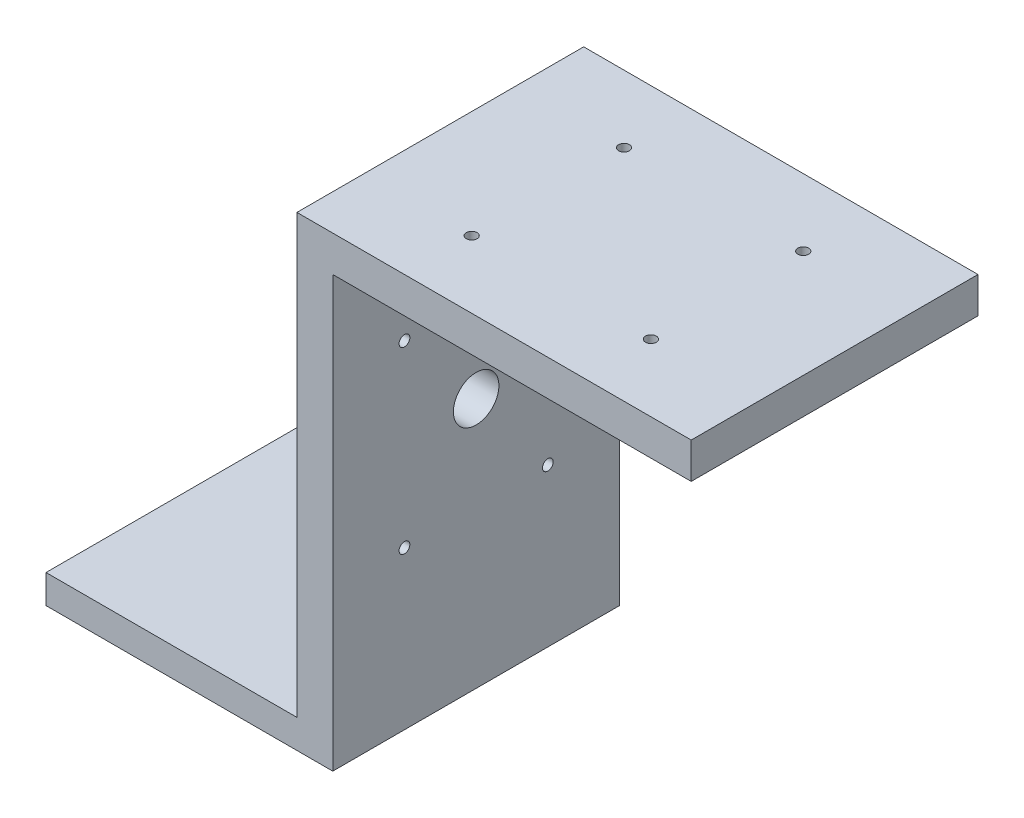
ISO-10303-21;
HEADER;
FILE_DESCRIPTION(('STEP AP214'),'2;1');
FILE_NAME('part.step','',(''),(''),'','','');
FILE_SCHEMA(('AUTOMOTIVE_DESIGN { 1 0 10303 214 1 1 1 1 }'));
ENDSEC;
DATA;
#1=APPLICATION_CONTEXT('core data for automotive mechanical design processes');
#2=APPLICATION_PROTOCOL_DEFINITION('international standard','automotive_design',2000,#1);
#3=PRODUCT_CONTEXT('',#1,'mechanical');
#4=PRODUCT('Part','Part','',(#3));
#5=PRODUCT_RELATED_PRODUCT_CATEGORY('part','',(#4));
#6=PRODUCT_DEFINITION_FORMATION('','',#4);
#7=PRODUCT_DEFINITION_CONTEXT('part definition',#1,'design');
#8=PRODUCT_DEFINITION('design','',#6,#7);
#9=PRODUCT_DEFINITION_SHAPE('','',#8);
#10=(LENGTH_UNIT() NAMED_UNIT(*) SI_UNIT(.MILLI.,.METRE.));
#11=(NAMED_UNIT(*) PLANE_ANGLE_UNIT() SI_UNIT($,.RADIAN.));
#12=(NAMED_UNIT(*) SI_UNIT($,.STERADIAN.) SOLID_ANGLE_UNIT());
#13=UNCERTAINTY_MEASURE_WITH_UNIT(LENGTH_MEASURE(1.E-05),#10,'distance_accuracy_value','');
#14=(GEOMETRIC_REPRESENTATION_CONTEXT(3) GLOBAL_UNCERTAINTY_ASSIGNED_CONTEXT((#13)) GLOBAL_UNIT_ASSIGNED_CONTEXT((#10,
#11,#12)) REPRESENTATION_CONTEXT('',''));
#15=CARTESIAN_POINT('',(0.,0.,0.));
#16=DIRECTION('',(0.,0.,1.));
#17=DIRECTION('',(1.,0.,0.));
#18=AXIS2_PLACEMENT_3D('',#15,#16,#17);
#19=CARTESIAN_POINT('',(0.,50.,20.));
#20=DIRECTION('',(-1.,0.,0.));
#21=DIRECTION('',(0.,0.,1.));
#22=AXIS2_PLACEMENT_3D('',#19,#20,#21);
#23=PLANE('',#22);
#24=CARTESIAN_POINT('',(0.,35.,0.));
#25=DIRECTION('',(-1.,0.,0.));
#26=DIRECTION('',(0.,0.,1.));
#27=AXIS2_PLACEMENT_3D('',#24,#25,#26);
#28=CIRCLE('',#27,3.175);
#29=CARTESIAN_POINT('',(0.,35.,3.175));
#30=VERTEX_POINT('',#29);
#31=EDGE_CURVE('E260',#30,#30,#28,.T.);
#32=ORIENTED_EDGE('',*,*,#31,.T.);
#33=EDGE_LOOP('',(#32));
#34=FACE_BOUND('',#33,.T.);
#35=CARTESIAN_POINT('',(0.,47.,-9.99999999999999));
#36=DIRECTION('',(-1.,0.,0.));
#37=DIRECTION('',(0.,0.,1.));
#38=AXIS2_PLACEMENT_3D('',#35,#36,#37);
#39=CIRCLE('',#38,0.75);
#40=CARTESIAN_POINT('',(0.,47.,-9.24999999999999));
#41=VERTEX_POINT('',#40);
#42=EDGE_CURVE('E133',#41,#41,#39,.T.);
#43=ORIENTED_EDGE('',*,*,#42,.T.);
#44=EDGE_LOOP('',(#43));
#45=FACE_BOUND('',#44,.T.);
#46=CARTESIAN_POINT('',(0.,47.,9.99999999999999));
#47=DIRECTION('',(-1.,0.,0.));
#48=DIRECTION('',(0.,0.,1.));
#49=AXIS2_PLACEMENT_3D('',#46,#47,#48);
#50=CIRCLE('',#49,0.75);
#51=CARTESIAN_POINT('',(0.,47.,10.75));
#52=VERTEX_POINT('',#51);
#53=EDGE_CURVE('E305',#52,#52,#50,.T.);
#54=ORIENTED_EDGE('',*,*,#53,.T.);
#55=EDGE_LOOP('',(#54));
#56=FACE_BOUND('',#55,.T.);
#57=CARTESIAN_POINT('',(0.,22.,9.99999999999999));
#58=DIRECTION('',(-1.,0.,0.));
#59=DIRECTION('',(0.,0.,1.));
#60=AXIS2_PLACEMENT_3D('',#57,#58,#59);
#61=CIRCLE('',#60,0.75);
#62=CARTESIAN_POINT('',(0.,22.,10.75));
#63=VERTEX_POINT('',#62);
#64=EDGE_CURVE('E302',#63,#63,#61,.T.);
#65=ORIENTED_EDGE('',*,*,#64,.T.);
#66=EDGE_LOOP('',(#65));
#67=FACE_BOUND('',#66,.T.);
#68=CARTESIAN_POINT('',(0.,22.,-9.99999999999999));
#69=DIRECTION('',(-1.,0.,0.));
#70=DIRECTION('',(0.,0.,1.));
#71=AXIS2_PLACEMENT_3D('',#68,#69,#70);
#72=CIRCLE('',#71,0.75);
#73=CARTESIAN_POINT('',(0.,22.,-9.24999999999999));
#74=VERTEX_POINT('',#73);
#75=EDGE_CURVE('E299',#74,#74,#72,.T.);
#76=ORIENTED_EDGE('',*,*,#75,.T.);
#77=EDGE_LOOP('',(#76));
#78=FACE_BOUND('',#77,.T.);
#79=DIRECTION('',(0.,1.,0.));
#80=VECTOR('',#79,1.);
#81=CARTESIAN_POINT('',(0.,50.,-20.));
#82=LINE('',#81,#80);
#83=CARTESIAN_POINT('',(0.,0.,-20.));
#84=VERTEX_POINT('',#83);
#85=CARTESIAN_POINT('',(0.,60.,-20.));
#86=VERTEX_POINT('',#85);
#87=EDGE_CURVE('E130',#84,#86,#82,.T.);
#88=ORIENTED_EDGE('',*,*,#87,.T.);
#89=DIRECTION('',(0.,0.,-1.));
#90=VECTOR('',#89,1.);
#91=CARTESIAN_POINT('',(0.,60.,20.));
#92=LINE('',#91,#90);
#93=CARTESIAN_POINT('',(0.,60.,20.));
#94=VERTEX_POINT('',#93);
#95=EDGE_CURVE('E12',#94,#86,#92,.T.);
#96=ORIENTED_EDGE('',*,*,#95,.F.);
#97=DIRECTION('',(0.,1.,0.));
#98=VECTOR('',#97,1.);
#99=CARTESIAN_POINT('',(0.,50.,20.));
#100=LINE('',#99,#98);
#101=CARTESIAN_POINT('',(0.,0.,20.));
#102=VERTEX_POINT('',#101);
#103=EDGE_CURVE('E102',#102,#94,#100,.T.);
#104=ORIENTED_EDGE('',*,*,#103,.F.);
#105=DIRECTION('',(0.,0.,-1.));
#106=VECTOR('',#105,1.);
#107=CARTESIAN_POINT('',(0.,0.,20.));
#108=LINE('',#107,#106);
#109=EDGE_CURVE('E129',#102,#84,#108,.T.);
#110=ORIENTED_EDGE('',*,*,#109,.T.);
#111=EDGE_LOOP('',(#88,#96,#104,#110));
#112=FACE_BOUND('',#111,.T.);
#113=ADVANCED_FACE('F39',(#34,#45,#56,#67,#78,#112),#23,.F.);
#114=CARTESIAN_POINT('',(50.,60.,20.));
#115=DIRECTION('',(0.,1.,0.));
#116=DIRECTION('',(-1.,0.,0.));
#117=AXIS2_PLACEMENT_3D('',#114,#115,#116);
#118=PLANE('',#117);
#119=CARTESIAN_POINT('',(10.,60.,10.625));
#120=DIRECTION('',(0.,1.,0.));
#121=DIRECTION('',(-1.,0.,0.));
#122=AXIS2_PLACEMENT_3D('',#119,#120,#121);
#123=CIRCLE('',#122,0.75);
#124=CARTESIAN_POINT('',(9.25,60.,10.625));
#125=VERTEX_POINT('',#124);
#126=EDGE_CURVE('E284',#125,#125,#123,.F.);
#127=ORIENTED_EDGE('',*,*,#126,.F.);
#128=EDGE_LOOP('',(#127));
#129=FACE_BOUND('',#128,.T.);
#130=CARTESIAN_POINT('',(35.,60.,10.625));
#131=DIRECTION('',(0.,1.,0.));
#132=DIRECTION('',(-1.,0.,0.));
#133=AXIS2_PLACEMENT_3D('',#130,#131,#132);
#134=CIRCLE('',#133,0.749999999999999);
#135=CARTESIAN_POINT('',(34.25,60.,10.625));
#136=VERTEX_POINT('',#135);
#137=EDGE_CURVE('E281',#136,#136,#134,.F.);
#138=ORIENTED_EDGE('',*,*,#137,.F.);
#139=EDGE_LOOP('',(#138));
#140=FACE_BOUND('',#139,.T.);
#141=CARTESIAN_POINT('',(35.,60.,-10.625));
#142=DIRECTION('',(0.,1.,0.));
#143=DIRECTION('',(-1.,0.,0.));
#144=AXIS2_PLACEMENT_3D('',#141,#142,#143);
#145=CIRCLE('',#144,0.749999999999999);
#146=CARTESIAN_POINT('',(34.25,60.,-10.625));
#147=VERTEX_POINT('',#146);
#148=EDGE_CURVE('E278',#147,#147,#145,.F.);
#149=ORIENTED_EDGE('',*,*,#148,.F.);
#150=EDGE_LOOP('',(#149));
#151=FACE_BOUND('',#150,.T.);
#152=CARTESIAN_POINT('',(10.,60.,-10.625));
#153=DIRECTION('',(0.,1.,0.));
#154=DIRECTION('',(-1.,0.,0.));
#155=AXIS2_PLACEMENT_3D('',#152,#153,#154);
#156=CIRCLE('',#155,0.75);
#157=CARTESIAN_POINT('',(9.25,60.,-10.625));
#158=VERTEX_POINT('',#157);
#159=EDGE_CURVE('E275',#158,#158,#156,.F.);
#160=ORIENTED_EDGE('',*,*,#159,.F.);
#161=EDGE_LOOP('',(#160));
#162=FACE_BOUND('',#161,.T.);
#163=DIRECTION('',(1.,0.,0.));
#164=VECTOR('',#163,1.);
#165=CARTESIAN_POINT('',(50.,60.,-20.));
#166=LINE('',#165,#164);
#167=CARTESIAN_POINT('',(50.,60.,-20.));
#168=VERTEX_POINT('',#167);
#169=EDGE_CURVE('E107',#86,#168,#166,.T.);
#170=ORIENTED_EDGE('',*,*,#169,.T.);
#171=DIRECTION('',(0.,0.,-1.));
#172=VECTOR('',#171,1.);
#173=CARTESIAN_POINT('',(50.,60.,20.));
#174=LINE('',#173,#172);
#175=CARTESIAN_POINT('',(50.,60.,20.));
#176=VERTEX_POINT('',#175);
#177=EDGE_CURVE('E43',#176,#168,#174,.T.);
#178=ORIENTED_EDGE('',*,*,#177,.F.);
#179=DIRECTION('',(1.,0.,0.));
#180=VECTOR('',#179,1.);
#181=CARTESIAN_POINT('',(50.,60.,20.));
#182=LINE('',#181,#180);
#183=EDGE_CURVE('E95',#94,#176,#182,.T.);
#184=ORIENTED_EDGE('',*,*,#183,.F.);
#185=ORIENTED_EDGE('',*,*,#95,.T.);
#186=EDGE_LOOP('',(#170,#178,#184,#185));
#187=FACE_BOUND('',#186,.T.);
#188=ADVANCED_FACE('F41',(#129,#140,#151,#162,#187),#118,.F.);
#189=CARTESIAN_POINT('',(50.,55.,20.));
#190=DIRECTION('',(-1.,0.,0.));
#191=DIRECTION('',(0.,-1.,0.));
#192=AXIS2_PLACEMENT_3D('',#189,#190,#191);
#193=PLANE('',#192);
#194=DIRECTION('',(0.,1.,0.));
#195=VECTOR('',#194,1.);
#196=CARTESIAN_POINT('',(50.,55.,-20.));
#197=LINE('',#196,#195);
#198=CARTESIAN_POINT('',(50.,65.,-20.));
#199=VERTEX_POINT('',#198);
#200=EDGE_CURVE('E134',#168,#199,#197,.T.);
#201=ORIENTED_EDGE('',*,*,#200,.T.);
#202=DIRECTION('',(0.,0.,-1.));
#203=VECTOR('',#202,1.);
#204=CARTESIAN_POINT('',(50.,65.,20.));
#205=LINE('',#204,#203);
#206=CARTESIAN_POINT('',(50.,65.,20.));
#207=VERTEX_POINT('',#206);
#208=EDGE_CURVE('E110',#207,#199,#205,.T.);
#209=ORIENTED_EDGE('',*,*,#208,.F.);
#210=DIRECTION('',(0.,1.,0.));
#211=VECTOR('',#210,1.);
#212=CARTESIAN_POINT('',(50.,55.,20.));
#213=LINE('',#212,#211);
#214=EDGE_CURVE('E99',#176,#207,#213,.T.);
#215=ORIENTED_EDGE('',*,*,#214,.F.);
#216=ORIENTED_EDGE('',*,*,#177,.T.);
#217=EDGE_LOOP('',(#201,#209,#215,#216));
#218=FACE_BOUND('',#217,.T.);
#219=ADVANCED_FACE('F111',(#218),#193,.F.);
#220=CARTESIAN_POINT('',(-5.00000000000001,65.,20.));
#221=DIRECTION('',(0.,-1.,0.));
#222=DIRECTION('',(0.,0.,-1.));
#223=AXIS2_PLACEMENT_3D('',#220,#221,#222);
#224=PLANE('',#223);
#225=CARTESIAN_POINT('',(10.,65.,10.625));
#226=DIRECTION('',(0.,-1.,0.));
#227=DIRECTION('',(0.,0.,1.));
#228=AXIS2_PLACEMENT_3D('',#225,#226,#227);
#229=CIRCLE('',#228,0.75);
#230=CARTESIAN_POINT('',(10.,65.,11.375));
#231=VERTEX_POINT('',#230);
#232=EDGE_CURVE('E261',#231,#231,#229,.T.);
#233=ORIENTED_EDGE('',*,*,#232,.T.);
#234=EDGE_LOOP('',(#233));
#235=FACE_BOUND('',#234,.T.);
#236=CARTESIAN_POINT('',(35.,65.,10.625));
#237=DIRECTION('',(0.,-1.,0.));
#238=DIRECTION('',(0.,0.,-1.));
#239=AXIS2_PLACEMENT_3D('',#236,#237,#238);
#240=CIRCLE('',#239,0.749999999999999);
#241=CARTESIAN_POINT('',(35.,65.,9.875));
#242=VERTEX_POINT('',#241);
#243=EDGE_CURVE('E263',#242,#242,#240,.T.);
#244=ORIENTED_EDGE('',*,*,#243,.T.);
#245=EDGE_LOOP('',(#244));
#246=FACE_BOUND('',#245,.T.);
#247=CARTESIAN_POINT('',(35.,65.,-10.625));
#248=DIRECTION('',(0.,-1.,0.));
#249=DIRECTION('',(0.,0.,1.));
#250=AXIS2_PLACEMENT_3D('',#247,#248,#249);
#251=CIRCLE('',#250,0.749999999999999);
#252=CARTESIAN_POINT('',(35.,65.,-9.875));
#253=VERTEX_POINT('',#252);
#254=EDGE_CURVE('E267',#253,#253,#251,.T.);
#255=ORIENTED_EDGE('',*,*,#254,.T.);
#256=EDGE_LOOP('',(#255));
#257=FACE_BOUND('',#256,.T.);
#258=CARTESIAN_POINT('',(10.,65.,-10.625));
#259=DIRECTION('',(0.,-1.,0.));
#260=DIRECTION('',(0.,0.,-1.));
#261=AXIS2_PLACEMENT_3D('',#258,#259,#260);
#262=CIRCLE('',#261,0.75);
#263=CARTESIAN_POINT('',(10.,65.,-11.375));
#264=VERTEX_POINT('',#263);
#265=EDGE_CURVE('E270',#264,#264,#262,.T.);
#266=ORIENTED_EDGE('',*,*,#265,.T.);
#267=EDGE_LOOP('',(#266));
#268=FACE_BOUND('',#267,.T.);
#269=DIRECTION('',(-1.,0.,0.));
#270=VECTOR('',#269,1.);
#271=CARTESIAN_POINT('',(-5.00000000000001,65.,-20.));
#272=LINE('',#271,#270);
#273=CARTESIAN_POINT('',(-5.00000000000001,65.,-20.));
#274=VERTEX_POINT('',#273);
#275=EDGE_CURVE('E136',#199,#274,#272,.T.);
#276=ORIENTED_EDGE('',*,*,#275,.T.);
#277=DIRECTION('',(0.,0.,-1.));
#278=VECTOR('',#277,1.);
#279=CARTESIAN_POINT('',(-5.00000000000001,65.,20.));
#280=LINE('',#279,#278);
#281=CARTESIAN_POINT('',(-5.00000000000001,65.,20.));
#282=VERTEX_POINT('',#281);
#283=EDGE_CURVE('E156',#282,#274,#280,.T.);
#284=ORIENTED_EDGE('',*,*,#283,.F.);
#285=DIRECTION('',(-1.,0.,0.));
#286=VECTOR('',#285,1.);
#287=CARTESIAN_POINT('',(-5.00000000000001,65.,20.));
#288=LINE('',#287,#286);
#289=EDGE_CURVE('E114',#207,#282,#288,.T.);
#290=ORIENTED_EDGE('',*,*,#289,.F.);
#291=ORIENTED_EDGE('',*,*,#208,.T.);
#292=EDGE_LOOP('',(#276,#284,#290,#291));
#293=FACE_BOUND('',#292,.T.);
#294=ADVANCED_FACE('F184',(#235,#246,#257,#268,#293),#224,.F.);
#295=CARTESIAN_POINT('',(-5.,3.99999999999999,20.));
#296=DIRECTION('',(1.,0.,0.));
#297=DIRECTION('',(0.,1.,0.));
#298=AXIS2_PLACEMENT_3D('',#295,#296,#297);
#299=PLANE('',#298);
#300=CARTESIAN_POINT('',(-5.,35.,0.));
#301=DIRECTION('',(-1.,0.,0.));
#302=DIRECTION('',(0.,-1.,0.));
#303=AXIS2_PLACEMENT_3D('',#300,#301,#302);
#304=CIRCLE('',#303,3.175);
#305=CARTESIAN_POINT('',(-5.,31.825,0.));
#306=VERTEX_POINT('',#305);
#307=EDGE_CURVE('E258',#306,#306,#304,.T.);
#308=ORIENTED_EDGE('',*,*,#307,.F.);
#309=EDGE_LOOP('',(#308));
#310=FACE_BOUND('',#309,.T.);
#311=CARTESIAN_POINT('',(-5.,47.,-9.99999999999999));
#312=DIRECTION('',(-1.,0.,0.));
#313=DIRECTION('',(0.,0.,-1.));
#314=AXIS2_PLACEMENT_3D('',#311,#312,#313);
#315=CIRCLE('',#314,0.75);
#316=CARTESIAN_POINT('',(-5.,47.,-10.75));
#317=VERTEX_POINT('',#316);
#318=EDGE_CURVE('E287',#317,#317,#315,.T.);
#319=ORIENTED_EDGE('',*,*,#318,.F.);
#320=EDGE_LOOP('',(#319));
#321=FACE_BOUND('',#320,.T.);
#322=CARTESIAN_POINT('',(-5.,47.,9.99999999999999));
#323=DIRECTION('',(-1.,0.,0.));
#324=DIRECTION('',(0.,0.,1.));
#325=AXIS2_PLACEMENT_3D('',#322,#323,#324);
#326=CIRCLE('',#325,0.75);
#327=CARTESIAN_POINT('',(-5.,47.,10.75));
#328=VERTEX_POINT('',#327);
#329=EDGE_CURVE('E292',#328,#328,#326,.T.);
#330=ORIENTED_EDGE('',*,*,#329,.F.);
#331=EDGE_LOOP('',(#330));
#332=FACE_BOUND('',#331,.T.);
#333=CARTESIAN_POINT('',(-5.,22.,9.99999999999999));
#334=DIRECTION('',(-1.,0.,0.));
#335=DIRECTION('',(0.,0.,-1.));
#336=AXIS2_PLACEMENT_3D('',#333,#334,#335);
#337=CIRCLE('',#336,0.75);
#338=CARTESIAN_POINT('',(-5.,22.,9.24999999999999));
#339=VERTEX_POINT('',#338);
#340=EDGE_CURVE('E288',#339,#339,#337,.T.);
#341=ORIENTED_EDGE('',*,*,#340,.F.);
#342=EDGE_LOOP('',(#341));
#343=FACE_BOUND('',#342,.T.);
#344=CARTESIAN_POINT('',(-5.,22.,-9.99999999999999));
#345=DIRECTION('',(-1.,0.,0.));
#346=DIRECTION('',(0.,0.,1.));
#347=AXIS2_PLACEMENT_3D('',#344,#345,#346);
#348=CIRCLE('',#347,0.75);
#349=CARTESIAN_POINT('',(-5.,22.,-9.24999999999999));
#350=VERTEX_POINT('',#349);
#351=EDGE_CURVE('E291',#350,#350,#348,.T.);
#352=ORIENTED_EDGE('',*,*,#351,.F.);
#353=EDGE_LOOP('',(#352));
#354=FACE_BOUND('',#353,.T.);
#355=DIRECTION('',(0.,-1.,0.));
#356=VECTOR('',#355,1.);
#357=CARTESIAN_POINT('',(-5.,3.99999999999999,-20.));
#358=LINE('',#357,#356);
#359=CARTESIAN_POINT('',(-5.,3.99999999999999,-20.));
#360=VERTEX_POINT('',#359);
#361=EDGE_CURVE('E137',#274,#360,#358,.T.);
#362=ORIENTED_EDGE('',*,*,#361,.T.);
#363=DIRECTION('',(0.,0.,-1.));
#364=VECTOR('',#363,1.);
#365=CARTESIAN_POINT('',(-5.,3.99999999999999,20.));
#366=LINE('',#365,#364);
#367=CARTESIAN_POINT('',(-5.,3.99999999999999,20.));
#368=VERTEX_POINT('',#367);
#369=EDGE_CURVE('E153',#368,#360,#366,.T.);
#370=ORIENTED_EDGE('',*,*,#369,.F.);
#371=DIRECTION('',(0.,-1.,0.));
#372=VECTOR('',#371,1.);
#373=CARTESIAN_POINT('',(-5.,3.99999999999999,20.));
#374=LINE('',#373,#372);
#375=EDGE_CURVE('E116',#282,#368,#374,.T.);
#376=ORIENTED_EDGE('',*,*,#375,.F.);
#377=ORIENTED_EDGE('',*,*,#283,.T.);
#378=EDGE_LOOP('',(#362,#370,#376,#377));
#379=FACE_BOUND('',#378,.T.);
#380=ADVANCED_FACE('F165',(#310,#321,#332,#343,#354,#379),#299,.F.);
#381=CARTESIAN_POINT('',(-40.,3.99999999999999,20.));
#382=DIRECTION('',(0.,-1.,0.));
#383=DIRECTION('',(0.,0.,-1.));
#384=AXIS2_PLACEMENT_3D('',#381,#382,#383);
#385=PLANE('',#384);
#386=DIRECTION('',(-1.,0.,0.));
#387=VECTOR('',#386,1.);
#388=CARTESIAN_POINT('',(-40.,3.99999999999999,-20.));
#389=LINE('',#388,#387);
#390=CARTESIAN_POINT('',(-40.,3.99999999999999,-20.));
#391=VERTEX_POINT('',#390);
#392=EDGE_CURVE('E139',#360,#391,#389,.T.);
#393=ORIENTED_EDGE('',*,*,#392,.T.);
#394=DIRECTION('',(0.,0.,-1.));
#395=VECTOR('',#394,1.);
#396=CARTESIAN_POINT('',(-40.,3.99999999999999,20.));
#397=LINE('',#396,#395);
#398=CARTESIAN_POINT('',(-40.,3.99999999999999,20.));
#399=VERTEX_POINT('',#398);
#400=EDGE_CURVE('E150',#399,#391,#397,.T.);
#401=ORIENTED_EDGE('',*,*,#400,.F.);
#402=DIRECTION('',(-1.,0.,0.));
#403=VECTOR('',#402,1.);
#404=CARTESIAN_POINT('',(-40.,3.99999999999999,20.));
#405=LINE('',#404,#403);
#406=EDGE_CURVE('E123',#368,#399,#405,.T.);
#407=ORIENTED_EDGE('',*,*,#406,.F.);
#408=ORIENTED_EDGE('',*,*,#369,.T.);
#409=EDGE_LOOP('',(#393,#401,#407,#408));
#410=FACE_BOUND('',#409,.T.);
#411=ADVANCED_FACE('F177',(#410),#385,.F.);
#412=CARTESIAN_POINT('',(-40.,0.,20.));
#413=DIRECTION('',(1.,0.,0.));
#414=DIRECTION('',(0.,0.,-1.));
#415=AXIS2_PLACEMENT_3D('',#412,#413,#414);
#416=PLANE('',#415);
#417=DIRECTION('',(0.,-1.,0.));
#418=VECTOR('',#417,1.);
#419=CARTESIAN_POINT('',(-40.,0.,-20.));
#420=LINE('',#419,#418);
#421=CARTESIAN_POINT('',(-40.,0.,-20.));
#422=VERTEX_POINT('',#421);
#423=EDGE_CURVE('E141',#391,#422,#420,.T.);
#424=ORIENTED_EDGE('',*,*,#423,.T.);
#425=DIRECTION('',(0.,0.,-1.));
#426=VECTOR('',#425,1.);
#427=CARTESIAN_POINT('',(-40.,0.,20.));
#428=LINE('',#427,#426);
#429=CARTESIAN_POINT('',(-40.,0.,20.));
#430=VERTEX_POINT('',#429);
#431=EDGE_CURVE('E147',#430,#422,#428,.T.);
#432=ORIENTED_EDGE('',*,*,#431,.F.);
#433=DIRECTION('',(0.,-1.,0.));
#434=VECTOR('',#433,1.);
#435=CARTESIAN_POINT('',(-40.,0.,20.));
#436=LINE('',#435,#434);
#437=EDGE_CURVE('E126',#399,#430,#436,.T.);
#438=ORIENTED_EDGE('',*,*,#437,.F.);
#439=ORIENTED_EDGE('',*,*,#400,.T.);
#440=EDGE_LOOP('',(#424,#432,#438,#439));
#441=FACE_BOUND('',#440,.T.);
#442=ADVANCED_FACE('F181',(#441),#416,.F.);
#443=CARTESIAN_POINT('',(0.,0.,20.));
#444=DIRECTION('',(0.,1.,0.));
#445=DIRECTION('',(-1.,0.,0.));
#446=AXIS2_PLACEMENT_3D('',#443,#444,#445);
#447=PLANE('',#446);
#448=DIRECTION('',(1.,0.,0.));
#449=VECTOR('',#448,1.);
#450=CARTESIAN_POINT('',(0.,0.,-20.));
#451=LINE('',#450,#449);
#452=EDGE_CURVE('E143',#422,#84,#451,.T.);
#453=ORIENTED_EDGE('',*,*,#452,.T.);
#454=ORIENTED_EDGE('',*,*,#109,.F.);
#455=DIRECTION('',(1.,0.,0.));
#456=VECTOR('',#455,1.);
#457=CARTESIAN_POINT('',(0.,0.,20.));
#458=LINE('',#457,#456);
#459=EDGE_CURVE('E57',#430,#102,#458,.T.);
#460=ORIENTED_EDGE('',*,*,#459,.F.);
#461=ORIENTED_EDGE('',*,*,#431,.T.);
#462=EDGE_LOOP('',(#453,#454,#460,#461));
#463=FACE_BOUND('',#462,.T.);
#464=ADVANCED_FACE('F210',(#463),#447,.F.);
#465=CARTESIAN_POINT('',(0.,0.,20.));
#466=DIRECTION('',(0.,0.,-1.));
#467=DIRECTION('',(-1.,0.,0.));
#468=AXIS2_PLACEMENT_3D('',#465,#466,#467);
#469=PLANE('',#468);
#470=ORIENTED_EDGE('',*,*,#103,.T.);
#471=ORIENTED_EDGE('',*,*,#183,.T.);
#472=ORIENTED_EDGE('',*,*,#214,.T.);
#473=ORIENTED_EDGE('',*,*,#289,.T.);
#474=ORIENTED_EDGE('',*,*,#375,.T.);
#475=ORIENTED_EDGE('',*,*,#406,.T.);
#476=ORIENTED_EDGE('',*,*,#437,.T.);
#477=ORIENTED_EDGE('',*,*,#459,.T.);
#478=EDGE_LOOP('',(#470,#471,#472,#473,#474,#475,#476,#477));
#479=FACE_BOUND('',#478,.T.);
#480=ADVANCED_FACE('F97',(#479),#469,.F.);
#481=CARTESIAN_POINT('',(0.,0.,-20.));
#482=DIRECTION('',(0.,0.,-1.));
#483=DIRECTION('',(-1.,0.,0.));
#484=AXIS2_PLACEMENT_3D('',#481,#482,#483);
#485=PLANE('',#484);
#486=ORIENTED_EDGE('',*,*,#87,.F.);
#487=ORIENTED_EDGE('',*,*,#452,.F.);
#488=ORIENTED_EDGE('',*,*,#423,.F.);
#489=ORIENTED_EDGE('',*,*,#392,.F.);
#490=ORIENTED_EDGE('',*,*,#361,.F.);
#491=ORIENTED_EDGE('',*,*,#275,.F.);
#492=ORIENTED_EDGE('',*,*,#200,.F.);
#493=ORIENTED_EDGE('',*,*,#169,.F.);
#494=EDGE_LOOP('',(#486,#487,#488,#489,#490,#491,#492,#493));
#495=FACE_BOUND('',#494,.T.);
#496=ADVANCED_FACE('F172',(#495),#485,.T.);
#497=CARTESIAN_POINT('',(50.,22.,-9.99999999999999));
#498=DIRECTION('',(-1.,0.,0.));
#499=DIRECTION('',(0.,0.,1.));
#500=AXIS2_PLACEMENT_3D('',#497,#498,#499);
#501=CYLINDRICAL_SURFACE('',#500,0.75);
#502=ORIENTED_EDGE('',*,*,#351,.T.);
#503=EDGE_LOOP('',(#502));
#504=FACE_BOUND('',#503,.T.);
#505=ORIENTED_EDGE('',*,*,#75,.F.);
#506=EDGE_LOOP('',(#505));
#507=FACE_BOUND('',#506,.T.);
#508=ADVANCED_FACE('F216',(#504,#507),#501,.F.);
#509=CARTESIAN_POINT('',(50.,22.,9.99999999999999));
#510=DIRECTION('',(-1.,0.,0.));
#511=DIRECTION('',(0.,0.,1.));
#512=AXIS2_PLACEMENT_3D('',#509,#510,#511);
#513=CYLINDRICAL_SURFACE('',#512,0.75);
#514=ORIENTED_EDGE('',*,*,#340,.T.);
#515=EDGE_LOOP('',(#514));
#516=FACE_BOUND('',#515,.T.);
#517=ORIENTED_EDGE('',*,*,#64,.F.);
#518=EDGE_LOOP('',(#517));
#519=FACE_BOUND('',#518,.T.);
#520=ADVANCED_FACE('F221',(#516,#519),#513,.F.);
#521=CARTESIAN_POINT('',(50.,47.,9.99999999999999));
#522=DIRECTION('',(-1.,0.,0.));
#523=DIRECTION('',(0.,0.,1.));
#524=AXIS2_PLACEMENT_3D('',#521,#522,#523);
#525=CYLINDRICAL_SURFACE('',#524,0.75);
#526=ORIENTED_EDGE('',*,*,#329,.T.);
#527=EDGE_LOOP('',(#526));
#528=FACE_BOUND('',#527,.T.);
#529=ORIENTED_EDGE('',*,*,#53,.F.);
#530=EDGE_LOOP('',(#529));
#531=FACE_BOUND('',#530,.T.);
#532=ADVANCED_FACE('F227',(#528,#531),#525,.F.);
#533=CARTESIAN_POINT('',(50.,47.,-9.99999999999999));
#534=DIRECTION('',(-1.,0.,0.));
#535=DIRECTION('',(0.,0.,1.));
#536=AXIS2_PLACEMENT_3D('',#533,#534,#535);
#537=CYLINDRICAL_SURFACE('',#536,0.75);
#538=ORIENTED_EDGE('',*,*,#318,.T.);
#539=EDGE_LOOP('',(#538));
#540=FACE_BOUND('',#539,.T.);
#541=ORIENTED_EDGE('',*,*,#42,.F.);
#542=EDGE_LOOP('',(#541));
#543=FACE_BOUND('',#542,.T.);
#544=ADVANCED_FACE('F223',(#540,#543),#537,.F.);
#545=CARTESIAN_POINT('',(10.,0.,-10.625));
#546=DIRECTION('',(0.,1.,0.));
#547=DIRECTION('',(0.,0.,1.));
#548=AXIS2_PLACEMENT_3D('',#545,#546,#547);
#549=CYLINDRICAL_SURFACE('',#548,0.75);
#550=ORIENTED_EDGE('',*,*,#265,.F.);
#551=EDGE_LOOP('',(#550));
#552=FACE_BOUND('',#551,.T.);
#553=ORIENTED_EDGE('',*,*,#159,.T.);
#554=EDGE_LOOP('',(#553));
#555=FACE_BOUND('',#554,.T.);
#556=ADVANCED_FACE('F226',(#552,#555),#549,.F.);
#557=CARTESIAN_POINT('',(35.,0.,-10.625));
#558=DIRECTION('',(0.,1.,0.));
#559=DIRECTION('',(0.,0.,1.));
#560=AXIS2_PLACEMENT_3D('',#557,#558,#559);
#561=CYLINDRICAL_SURFACE('',#560,0.749999999999999);
#562=ORIENTED_EDGE('',*,*,#254,.F.);
#563=EDGE_LOOP('',(#562));
#564=FACE_BOUND('',#563,.T.);
#565=ORIENTED_EDGE('',*,*,#148,.T.);
#566=EDGE_LOOP('',(#565));
#567=FACE_BOUND('',#566,.T.);
#568=ADVANCED_FACE('F237',(#564,#567),#561,.F.);
#569=CARTESIAN_POINT('',(35.,0.,10.625));
#570=DIRECTION('',(0.,1.,0.));
#571=DIRECTION('',(0.,0.,1.));
#572=AXIS2_PLACEMENT_3D('',#569,#570,#571);
#573=CYLINDRICAL_SURFACE('',#572,0.749999999999999);
#574=ORIENTED_EDGE('',*,*,#243,.F.);
#575=EDGE_LOOP('',(#574));
#576=FACE_BOUND('',#575,.T.);
#577=ORIENTED_EDGE('',*,*,#137,.T.);
#578=EDGE_LOOP('',(#577));
#579=FACE_BOUND('',#578,.T.);
#580=ADVANCED_FACE('F243',(#576,#579),#573,.F.);
#581=CARTESIAN_POINT('',(10.,0.,10.625));
#582=DIRECTION('',(0.,1.,0.));
#583=DIRECTION('',(0.,0.,1.));
#584=AXIS2_PLACEMENT_3D('',#581,#582,#583);
#585=CYLINDRICAL_SURFACE('',#584,0.75);
#586=ORIENTED_EDGE('',*,*,#232,.F.);
#587=EDGE_LOOP('',(#586));
#588=FACE_BOUND('',#587,.T.);
#589=ORIENTED_EDGE('',*,*,#126,.T.);
#590=EDGE_LOOP('',(#589));
#591=FACE_BOUND('',#590,.T.);
#592=ADVANCED_FACE('F239',(#588,#591),#585,.F.);
#593=CARTESIAN_POINT('',(50.,35.,0.));
#594=DIRECTION('',(-1.,0.,0.));
#595=DIRECTION('',(0.,-1.,0.));
#596=AXIS2_PLACEMENT_3D('',#593,#594,#595);
#597=CYLINDRICAL_SURFACE('',#596,3.175);
#598=ORIENTED_EDGE('',*,*,#307,.T.);
#599=EDGE_LOOP('',(#598));
#600=FACE_BOUND('',#599,.T.);
#601=ORIENTED_EDGE('',*,*,#31,.F.);
#602=EDGE_LOOP('',(#601));
#603=FACE_BOUND('',#602,.T.);
#604=ADVANCED_FACE('F242',(#600,#603),#597,.F.);
#605=CLOSED_SHELL('',(#113,#188,#219,#294,#380,#411,#442,#464,#480,#496,#508,#520,#532,#544,
#556,#568,#580,#592,#604));
#606=MANIFOLD_SOLID_BREP('B2',#605);
#607=ADVANCED_BREP_SHAPE_REPRESENTATION('',(#18,#606),#14);
#608=SHAPE_DEFINITION_REPRESENTATION(#9,#607);
ENDSEC;
END-ISO-10303-21;
